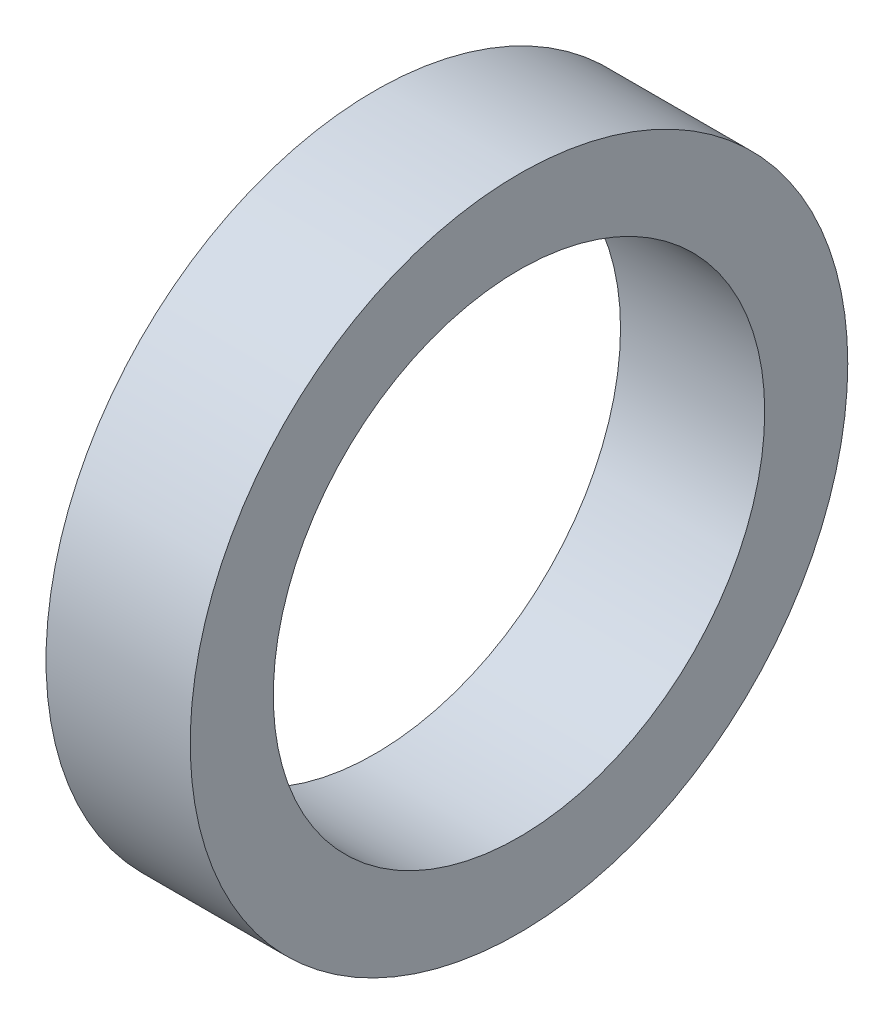
ISO-10303-21;
HEADER;
FILE_DESCRIPTION(('STEP AP214'),'2;1');
FILE_NAME('part.step','',(''),(''),'','','');
FILE_SCHEMA(('AUTOMOTIVE_DESIGN { 1 0 10303 214 1 1 1 1 }'));
ENDSEC;
DATA;
#1=APPLICATION_CONTEXT('core data for automotive mechanical design processes');
#2=APPLICATION_PROTOCOL_DEFINITION('international standard','automotive_design',2000,#1);
#3=PRODUCT_CONTEXT('',#1,'mechanical');
#4=PRODUCT('Part','Part','',(#3));
#5=PRODUCT_RELATED_PRODUCT_CATEGORY('part','',(#4));
#6=PRODUCT_DEFINITION_FORMATION('','',#4);
#7=PRODUCT_DEFINITION_CONTEXT('part definition',#1,'design');
#8=PRODUCT_DEFINITION('design','',#6,#7);
#9=PRODUCT_DEFINITION_SHAPE('','',#8);
#10=(LENGTH_UNIT() NAMED_UNIT(*) SI_UNIT(.MILLI.,.METRE.));
#11=(NAMED_UNIT(*) PLANE_ANGLE_UNIT() SI_UNIT($,.RADIAN.));
#12=(NAMED_UNIT(*) SI_UNIT($,.STERADIAN.) SOLID_ANGLE_UNIT());
#13=UNCERTAINTY_MEASURE_WITH_UNIT(LENGTH_MEASURE(1.E-05),#10,'distance_accuracy_value','');
#14=(GEOMETRIC_REPRESENTATION_CONTEXT(3) GLOBAL_UNCERTAINTY_ASSIGNED_CONTEXT((#13)) GLOBAL_UNIT_ASSIGNED_CONTEXT((#10,
#11,#12)) REPRESENTATION_CONTEXT('',''));
#15=CARTESIAN_POINT('',(0.,0.,0.));
#16=DIRECTION('',(0.,0.,1.));
#17=DIRECTION('',(1.,0.,0.));
#18=AXIS2_PLACEMENT_3D('',#15,#16,#17);
#19=CARTESIAN_POINT('',(2.38125,0.,0.));
#20=DIRECTION('',(1.,0.,0.));
#21=DIRECTION('',(0.,0.,-1.));
#22=AXIS2_PLACEMENT_3D('',#19,#20,#21);
#23=PLANE('',#22);
#24=CARTESIAN_POINT('',(2.38125,0.,0.));
#25=DIRECTION('',(1.,0.,0.));
#26=DIRECTION('',(0.,0.,-1.));
#27=AXIS2_PLACEMENT_3D('',#24,#25,#26);
#28=CIRCLE('',#27,8.1153);
#29=CARTESIAN_POINT('',(2.38125,0.,-8.1153));
#30=VERTEX_POINT('',#29);
#31=EDGE_CURVE('E26',#30,#30,#28,.F.);
#32=ORIENTED_EDGE('',*,*,#31,.T.);
#33=EDGE_LOOP('',(#32));
#34=FACE_BOUND('',#33,.T.);
#35=CARTESIAN_POINT('',(2.38125,0.,0.));
#36=DIRECTION('',(1.,0.,0.));
#37=DIRECTION('',(0.,0.,-1.));
#38=AXIS2_PLACEMENT_3D('',#35,#36,#37);
#39=CIRCLE('',#38,10.8585);
#40=CARTESIAN_POINT('',(2.38125,0.,-10.8585));
#41=VERTEX_POINT('',#40);
#42=EDGE_CURVE('E17',#41,#41,#39,.F.);
#43=ORIENTED_EDGE('',*,*,#42,.F.);
#44=EDGE_LOOP('',(#43));
#45=FACE_BOUND('',#44,.T.);
#46=ADVANCED_FACE('F14',(#34,#45),#23,.T.);
#47=CARTESIAN_POINT('',(-2.38125,0.,0.));
#48=DIRECTION('',(1.,0.,0.));
#49=DIRECTION('',(0.,0.,-1.));
#50=AXIS2_PLACEMENT_3D('',#47,#48,#49);
#51=CYLINDRICAL_SURFACE('',#50,10.8585);
#52=ORIENTED_EDGE('',*,*,#42,.T.);
#53=EDGE_LOOP('',(#52));
#54=FACE_BOUND('',#53,.T.);
#55=CARTESIAN_POINT('',(-2.38125,0.,0.));
#56=DIRECTION('',(1.,0.,0.));
#57=DIRECTION('',(0.,0.,-1.));
#58=AXIS2_PLACEMENT_3D('',#55,#56,#57);
#59=CIRCLE('',#58,10.8585);
#60=CARTESIAN_POINT('',(-2.38125,0.,-10.8585));
#61=VERTEX_POINT('',#60);
#62=EDGE_CURVE('E21',#61,#61,#59,.T.);
#63=ORIENTED_EDGE('',*,*,#62,.T.);
#64=EDGE_LOOP('',(#63));
#65=FACE_BOUND('',#64,.T.);
#66=ADVANCED_FACE('F34',(#54,#65),#51,.T.);
#67=CARTESIAN_POINT('',(-2.38125,0.,0.));
#68=DIRECTION('',(1.,0.,0.));
#69=DIRECTION('',(0.,0.,-1.));
#70=AXIS2_PLACEMENT_3D('',#67,#68,#69);
#71=CYLINDRICAL_SURFACE('',#70,8.1153);
#72=ORIENTED_EDGE('',*,*,#31,.F.);
#73=EDGE_LOOP('',(#72));
#74=FACE_BOUND('',#73,.T.);
#75=CARTESIAN_POINT('',(-2.38125,0.,0.));
#76=DIRECTION('',(1.,0.,0.));
#77=DIRECTION('',(0.,0.,-1.));
#78=AXIS2_PLACEMENT_3D('',#75,#76,#77);
#79=CIRCLE('',#78,8.1153);
#80=CARTESIAN_POINT('',(-2.38125,0.,-8.1153));
#81=VERTEX_POINT('',#80);
#82=EDGE_CURVE('E10',#81,#81,#79,.F.);
#83=ORIENTED_EDGE('',*,*,#82,.T.);
#84=EDGE_LOOP('',(#83));
#85=FACE_BOUND('',#84,.T.);
#86=ADVANCED_FACE('F42',(#74,#85),#71,.F.);
#87=CARTESIAN_POINT('',(-2.38125,0.,0.));
#88=DIRECTION('',(1.,0.,0.));
#89=DIRECTION('',(0.,0.,-1.));
#90=AXIS2_PLACEMENT_3D('',#87,#88,#89);
#91=PLANE('',#90);
#92=ORIENTED_EDGE('',*,*,#82,.F.);
#93=EDGE_LOOP('',(#92));
#94=FACE_BOUND('',#93,.T.);
#95=ORIENTED_EDGE('',*,*,#62,.F.);
#96=EDGE_LOOP('',(#95));
#97=FACE_BOUND('',#96,.T.);
#98=ADVANCED_FACE('F43',(#94,#97),#91,.F.);
#99=CLOSED_SHELL('',(#46,#66,#86,#98));
#100=MANIFOLD_SOLID_BREP('B1',#99);
#101=ADVANCED_BREP_SHAPE_REPRESENTATION('',(#18,#100),#14);
#102=SHAPE_DEFINITION_REPRESENTATION(#9,#101);
ENDSEC;
END-ISO-10303-21;
